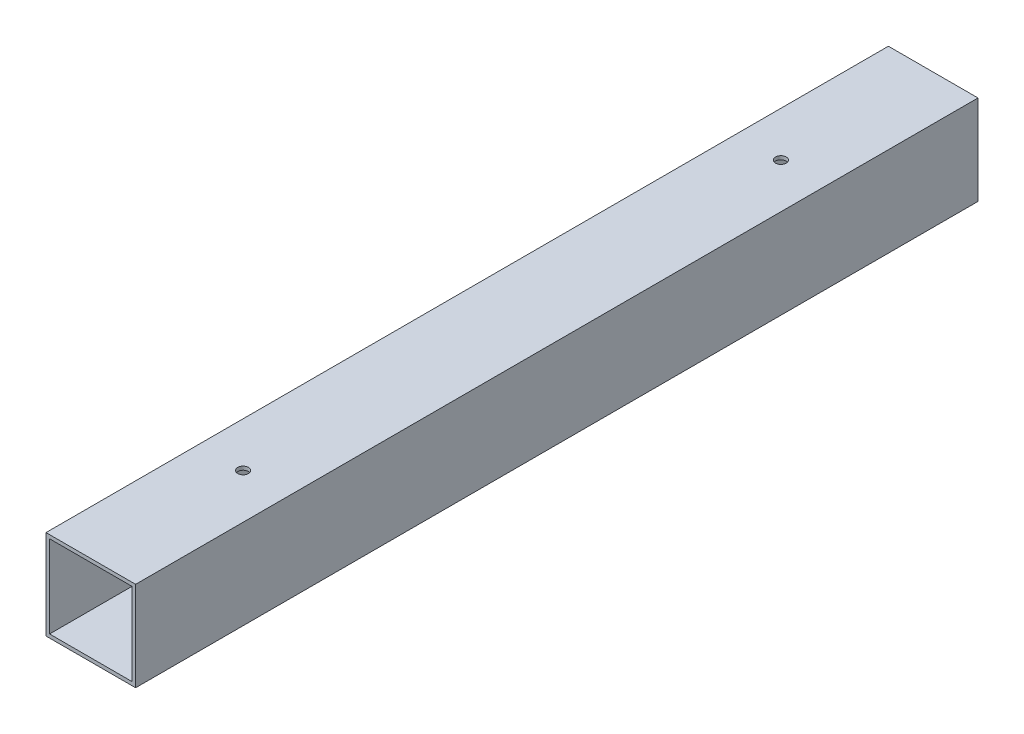
ISO-10303-21;
HEADER;
FILE_DESCRIPTION(('STEP AP214'),'2;1');
FILE_NAME('part.step','',(''),(''),'','','');
FILE_SCHEMA(('AUTOMOTIVE_DESIGN { 1 0 10303 214 1 1 1 1 }'));
ENDSEC;
DATA;
#1=APPLICATION_CONTEXT('core data for automotive mechanical design processes');
#2=APPLICATION_PROTOCOL_DEFINITION('international standard','automotive_design',2000,#1);
#3=PRODUCT_CONTEXT('',#1,'mechanical');
#4=PRODUCT('Part','Part','',(#3));
#5=PRODUCT_RELATED_PRODUCT_CATEGORY('part','',(#4));
#6=PRODUCT_DEFINITION_FORMATION('','',#4);
#7=PRODUCT_DEFINITION_CONTEXT('part definition',#1,'design');
#8=PRODUCT_DEFINITION('design','',#6,#7);
#9=PRODUCT_DEFINITION_SHAPE('','',#8);
#10=(LENGTH_UNIT() NAMED_UNIT(*) SI_UNIT(.MILLI.,.METRE.));
#11=(NAMED_UNIT(*) PLANE_ANGLE_UNIT() SI_UNIT($,.RADIAN.));
#12=(NAMED_UNIT(*) SI_UNIT($,.STERADIAN.) SOLID_ANGLE_UNIT());
#13=UNCERTAINTY_MEASURE_WITH_UNIT(LENGTH_MEASURE(1.E-05),#10,'distance_accuracy_value','');
#14=(GEOMETRIC_REPRESENTATION_CONTEXT(3) GLOBAL_UNCERTAINTY_ASSIGNED_CONTEXT((#13)) GLOBAL_UNIT_ASSIGNED_CONTEXT((#10,
#11,#12)) REPRESENTATION_CONTEXT('',''));
#15=CARTESIAN_POINT('',(0.,0.,0.));
#16=DIRECTION('',(0.,0.,1.));
#17=DIRECTION('',(1.,0.,0.));
#18=AXIS2_PLACEMENT_3D('',#15,#16,#17);
#19=CARTESIAN_POINT('',(0.,0.,117.5));
#20=DIRECTION('',(0.,0.,-1.));
#21=DIRECTION('',(-1.,0.,0.));
#22=AXIS2_PLACEMENT_3D('',#19,#20,#21);
#23=PLANE('',#22);
#24=DIRECTION('',(0.,1.,0.));
#25=VECTOR('',#24,1.);
#26=CARTESIAN_POINT('',(12.5,-12.5,117.5));
#27=LINE('',#26,#25);
#28=CARTESIAN_POINT('',(12.5,-12.5,117.5));
#29=VERTEX_POINT('',#28);
#30=CARTESIAN_POINT('',(12.5,12.5,117.5));
#31=VERTEX_POINT('',#30);
#32=EDGE_CURVE('E142',#29,#31,#27,.T.);
#33=ORIENTED_EDGE('',*,*,#32,.T.);
#34=DIRECTION('',(-1.,0.,0.));
#35=VECTOR('',#34,1.);
#36=CARTESIAN_POINT('',(-12.5,12.5,117.5));
#37=LINE('',#36,#35);
#38=CARTESIAN_POINT('',(-12.5,12.5,117.5));
#39=VERTEX_POINT('',#38);
#40=EDGE_CURVE('E145',#31,#39,#37,.T.);
#41=ORIENTED_EDGE('',*,*,#40,.T.);
#42=DIRECTION('',(0.,-1.,0.));
#43=VECTOR('',#42,1.);
#44=CARTESIAN_POINT('',(-12.5,-12.5,117.5));
#45=LINE('',#44,#43);
#46=CARTESIAN_POINT('',(-12.5,-12.5,117.5));
#47=VERTEX_POINT('',#46);
#48=EDGE_CURVE('E148',#39,#47,#45,.T.);
#49=ORIENTED_EDGE('',*,*,#48,.T.);
#50=DIRECTION('',(1.,0.,0.));
#51=VECTOR('',#50,1.);
#52=CARTESIAN_POINT('',(-12.5,-12.5,117.5));
#53=LINE('',#52,#51);
#54=EDGE_CURVE('E150',#47,#29,#53,.T.);
#55=ORIENTED_EDGE('',*,*,#54,.T.);
#56=EDGE_LOOP('',(#33,#41,#49,#55));
#57=FACE_BOUND('',#56,.T.);
#58=DIRECTION('',(0.,-1.,0.));
#59=VECTOR('',#58,1.);
#60=CARTESIAN_POINT('',(-11.5,-11.5,117.5));
#61=LINE('',#60,#59);
#62=CARTESIAN_POINT('',(-11.5,11.5,117.5));
#63=VERTEX_POINT('',#62);
#64=CARTESIAN_POINT('',(-11.5,-11.5,117.5));
#65=VERTEX_POINT('',#64);
#66=EDGE_CURVE('E104',#63,#65,#61,.T.);
#67=ORIENTED_EDGE('',*,*,#66,.F.);
#68=DIRECTION('',(-1.,0.,0.));
#69=VECTOR('',#68,1.);
#70=CARTESIAN_POINT('',(-11.5,11.5,117.5));
#71=LINE('',#70,#69);
#72=CARTESIAN_POINT('',(11.5,11.5,117.5));
#73=VERTEX_POINT('',#72);
#74=EDGE_CURVE('E126',#73,#63,#71,.T.);
#75=ORIENTED_EDGE('',*,*,#74,.F.);
#76=DIRECTION('',(0.,1.,0.));
#77=VECTOR('',#76,1.);
#78=CARTESIAN_POINT('',(11.5,-11.5,117.5));
#79=LINE('',#78,#77);
#80=CARTESIAN_POINT('',(11.5,-11.5,117.5));
#81=VERTEX_POINT('',#80);
#82=EDGE_CURVE('E124',#81,#73,#79,.T.);
#83=ORIENTED_EDGE('',*,*,#82,.F.);
#84=DIRECTION('',(1.,0.,0.));
#85=VECTOR('',#84,1.);
#86=CARTESIAN_POINT('',(-11.5,-11.5,117.5));
#87=LINE('',#86,#85);
#88=EDGE_CURVE('E112',#65,#81,#87,.T.);
#89=ORIENTED_EDGE('',*,*,#88,.F.);
#90=EDGE_LOOP('',(#67,#75,#83,#89));
#91=FACE_BOUND('',#90,.T.);
#92=ADVANCED_FACE('F37',(#57,#91),#23,.F.);
#93=CARTESIAN_POINT('',(0.,0.,-117.5));
#94=DIRECTION('',(0.,0.,-1.));
#95=DIRECTION('',(-1.,0.,0.));
#96=AXIS2_PLACEMENT_3D('',#93,#94,#95);
#97=PLANE('',#96);
#98=DIRECTION('',(0.,1.,0.));
#99=VECTOR('',#98,1.);
#100=CARTESIAN_POINT('',(12.5,-12.5,-117.5));
#101=LINE('',#100,#99);
#102=CARTESIAN_POINT('',(12.5,-12.5,-117.5));
#103=VERTEX_POINT('',#102);
#104=CARTESIAN_POINT('',(12.5,12.5,-117.5));
#105=VERTEX_POINT('',#104);
#106=EDGE_CURVE('E120',#103,#105,#101,.T.);
#107=ORIENTED_EDGE('',*,*,#106,.F.);
#108=DIRECTION('',(1.,0.,0.));
#109=VECTOR('',#108,1.);
#110=CARTESIAN_POINT('',(-12.5,-12.5,-117.5));
#111=LINE('',#110,#109);
#112=CARTESIAN_POINT('',(-12.5,-12.5,-117.5));
#113=VERTEX_POINT('',#112);
#114=EDGE_CURVE('E146',#113,#103,#111,.T.);
#115=ORIENTED_EDGE('',*,*,#114,.F.);
#116=DIRECTION('',(0.,-1.,0.));
#117=VECTOR('',#116,1.);
#118=CARTESIAN_POINT('',(-12.5,-12.5,-117.5));
#119=LINE('',#118,#117);
#120=CARTESIAN_POINT('',(-12.5,12.5,-117.5));
#121=VERTEX_POINT('',#120);
#122=EDGE_CURVE('E157',#121,#113,#119,.T.);
#123=ORIENTED_EDGE('',*,*,#122,.F.);
#124=DIRECTION('',(-1.,0.,0.));
#125=VECTOR('',#124,1.);
#126=CARTESIAN_POINT('',(-12.5,12.5,-117.5));
#127=LINE('',#126,#125);
#128=EDGE_CURVE('E155',#105,#121,#127,.T.);
#129=ORIENTED_EDGE('',*,*,#128,.F.);
#130=EDGE_LOOP('',(#107,#115,#123,#129));
#131=FACE_BOUND('',#130,.T.);
#132=DIRECTION('',(-1.,0.,0.));
#133=VECTOR('',#132,1.);
#134=CARTESIAN_POINT('',(-11.5,11.5,-117.5));
#135=LINE('',#134,#133);
#136=CARTESIAN_POINT('',(11.5,11.5,-117.5));
#137=VERTEX_POINT('',#136);
#138=CARTESIAN_POINT('',(-11.5,11.5,-117.5));
#139=VERTEX_POINT('',#138);
#140=EDGE_CURVE('E113',#137,#139,#135,.T.);
#141=ORIENTED_EDGE('',*,*,#140,.T.);
#142=DIRECTION('',(0.,-1.,0.));
#143=VECTOR('',#142,1.);
#144=CARTESIAN_POINT('',(-11.5,-11.5,-117.5));
#145=LINE('',#144,#143);
#146=CARTESIAN_POINT('',(-11.5,-11.5,-117.5));
#147=VERTEX_POINT('',#146);
#148=EDGE_CURVE('E62',#139,#147,#145,.T.);
#149=ORIENTED_EDGE('',*,*,#148,.T.);
#150=DIRECTION('',(1.,0.,0.));
#151=VECTOR('',#150,1.);
#152=CARTESIAN_POINT('',(-11.5,-11.5,-117.5));
#153=LINE('',#152,#151);
#154=CARTESIAN_POINT('',(11.5,-11.5,-117.5));
#155=VERTEX_POINT('',#154);
#156=EDGE_CURVE('E119',#147,#155,#153,.T.);
#157=ORIENTED_EDGE('',*,*,#156,.T.);
#158=DIRECTION('',(0.,1.,0.));
#159=VECTOR('',#158,1.);
#160=CARTESIAN_POINT('',(11.5,-11.5,-117.5));
#161=LINE('',#160,#159);
#162=EDGE_CURVE('E134',#155,#137,#161,.T.);
#163=ORIENTED_EDGE('',*,*,#162,.T.);
#164=EDGE_LOOP('',(#141,#149,#157,#163));
#165=FACE_BOUND('',#164,.T.);
#166=ADVANCED_FACE('F211',(#131,#165),#97,.T.);
#167=CARTESIAN_POINT('',(12.5,-12.5,117.5));
#168=DIRECTION('',(-1.,0.,0.));
#169=DIRECTION('',(0.,0.,1.));
#170=AXIS2_PLACEMENT_3D('',#167,#168,#169);
#171=PLANE('',#170);
#172=ORIENTED_EDGE('',*,*,#106,.T.);
#173=DIRECTION('',(0.,0.,-1.));
#174=VECTOR('',#173,1.);
#175=CARTESIAN_POINT('',(12.5,12.5,117.5));
#176=LINE('',#175,#174);
#177=EDGE_CURVE('E11',#31,#105,#176,.T.);
#178=ORIENTED_EDGE('',*,*,#177,.F.);
#179=ORIENTED_EDGE('',*,*,#32,.F.);
#180=DIRECTION('',(0.,0.,-1.));
#181=VECTOR('',#180,1.);
#182=CARTESIAN_POINT('',(12.5,-12.5,117.5));
#183=LINE('',#182,#181);
#184=EDGE_CURVE('E152',#29,#103,#183,.T.);
#185=ORIENTED_EDGE('',*,*,#184,.T.);
#186=EDGE_LOOP('',(#172,#178,#179,#185));
#187=FACE_BOUND('',#186,.T.);
#188=ADVANCED_FACE('F39',(#187),#171,.F.);
#189=CARTESIAN_POINT('',(-12.5,12.5,117.5));
#190=DIRECTION('',(0.,-1.,0.));
#191=DIRECTION('',(0.,0.,-1.));
#192=AXIS2_PLACEMENT_3D('',#189,#190,#191);
#193=PLANE('',#192);
#194=CARTESIAN_POINT('',(0.,12.5,-75.));
#195=DIRECTION('',(0.,-1.,0.));
#196=DIRECTION('',(0.,0.,-1.));
#197=AXIS2_PLACEMENT_3D('',#194,#195,#196);
#198=CIRCLE('',#197,1.5);
#199=CARTESIAN_POINT('',(0.,12.5,-73.5));
#200=VERTEX_POINT('',#199);
#201=EDGE_CURVE('E132',#200,#200,#198,.T.);
#202=ORIENTED_EDGE('',*,*,#201,.T.);
#203=EDGE_LOOP('',(#202));
#204=FACE_BOUND('',#203,.T.);
#205=CARTESIAN_POINT('',(0.,12.5,75.));
#206=DIRECTION('',(0.,-1.,0.));
#207=DIRECTION('',(0.,0.,-1.));
#208=AXIS2_PLACEMENT_3D('',#205,#206,#207);
#209=CIRCLE('',#208,1.5);
#210=CARTESIAN_POINT('',(0.,12.5,76.5));
#211=VERTEX_POINT('',#210);
#212=EDGE_CURVE('E173',#211,#211,#209,.T.);
#213=ORIENTED_EDGE('',*,*,#212,.T.);
#214=EDGE_LOOP('',(#213));
#215=FACE_BOUND('',#214,.T.);
#216=ORIENTED_EDGE('',*,*,#128,.T.);
#217=DIRECTION('',(0.,0.,-1.));
#218=VECTOR('',#217,1.);
#219=CARTESIAN_POINT('',(-12.5,12.5,117.5));
#220=LINE('',#219,#218);
#221=EDGE_CURVE('E46',#39,#121,#220,.T.);
#222=ORIENTED_EDGE('',*,*,#221,.F.);
#223=ORIENTED_EDGE('',*,*,#40,.F.);
#224=ORIENTED_EDGE('',*,*,#177,.T.);
#225=EDGE_LOOP('',(#216,#222,#223,#224));
#226=FACE_BOUND('',#225,.T.);
#227=ADVANCED_FACE('F190',(#204,#215,#226),#193,.F.);
#228=CARTESIAN_POINT('',(-12.5,-12.5,117.5));
#229=DIRECTION('',(1.,0.,0.));
#230=DIRECTION('',(0.,0.,-1.));
#231=AXIS2_PLACEMENT_3D('',#228,#229,#230);
#232=PLANE('',#231);
#233=ORIENTED_EDGE('',*,*,#122,.T.);
#234=DIRECTION('',(0.,0.,-1.));
#235=VECTOR('',#234,1.);
#236=CARTESIAN_POINT('',(-12.5,-12.5,117.5));
#237=LINE('',#236,#235);
#238=EDGE_CURVE('E162',#47,#113,#237,.T.);
#239=ORIENTED_EDGE('',*,*,#238,.F.);
#240=ORIENTED_EDGE('',*,*,#48,.F.);
#241=ORIENTED_EDGE('',*,*,#221,.T.);
#242=EDGE_LOOP('',(#233,#239,#240,#241));
#243=FACE_BOUND('',#242,.T.);
#244=ADVANCED_FACE('F225',(#243),#232,.F.);
#245=CARTESIAN_POINT('',(-12.5,-12.5,117.5));
#246=DIRECTION('',(0.,1.,0.));
#247=DIRECTION('',(0.,0.,1.));
#248=AXIS2_PLACEMENT_3D('',#245,#246,#247);
#249=PLANE('',#248);
#250=CARTESIAN_POINT('',(0.,-12.5,-75.));
#251=DIRECTION('',(0.,1.,0.));
#252=DIRECTION('',(0.,0.,1.));
#253=AXIS2_PLACEMENT_3D('',#250,#251,#252);
#254=CIRCLE('',#253,1.5);
#255=CARTESIAN_POINT('',(0.,-12.5,-73.5));
#256=VERTEX_POINT('',#255);
#257=EDGE_CURVE('E169',#256,#256,#254,.T.);
#258=ORIENTED_EDGE('',*,*,#257,.T.);
#259=EDGE_LOOP('',(#258));
#260=FACE_BOUND('',#259,.T.);
#261=CARTESIAN_POINT('',(0.,-12.5,75.));
#262=DIRECTION('',(0.,1.,0.));
#263=DIRECTION('',(0.,0.,1.));
#264=AXIS2_PLACEMENT_3D('',#261,#262,#263);
#265=CIRCLE('',#264,1.5);
#266=CARTESIAN_POINT('',(0.,-12.5,76.5));
#267=VERTEX_POINT('',#266);
#268=EDGE_CURVE('E176',#267,#267,#265,.T.);
#269=ORIENTED_EDGE('',*,*,#268,.T.);
#270=EDGE_LOOP('',(#269));
#271=FACE_BOUND('',#270,.T.);
#272=ORIENTED_EDGE('',*,*,#114,.T.);
#273=ORIENTED_EDGE('',*,*,#184,.F.);
#274=ORIENTED_EDGE('',*,*,#54,.F.);
#275=ORIENTED_EDGE('',*,*,#238,.T.);
#276=EDGE_LOOP('',(#272,#273,#274,#275));
#277=FACE_BOUND('',#276,.T.);
#278=ADVANCED_FACE('F222',(#260,#271,#277),#249,.F.);
#279=CARTESIAN_POINT('',(-11.5,-11.5,117.5));
#280=DIRECTION('',(1.,0.,0.));
#281=DIRECTION('',(0.,0.,-1.));
#282=AXIS2_PLACEMENT_3D('',#279,#280,#281);
#283=PLANE('',#282);
#284=ORIENTED_EDGE('',*,*,#148,.F.);
#285=DIRECTION('',(0.,0.,-1.));
#286=VECTOR('',#285,1.);
#287=CARTESIAN_POINT('',(-11.5,11.5,117.5));
#288=LINE('',#287,#286);
#289=EDGE_CURVE('E108',#63,#139,#288,.T.);
#290=ORIENTED_EDGE('',*,*,#289,.F.);
#291=ORIENTED_EDGE('',*,*,#66,.T.);
#292=DIRECTION('',(0.,0.,-1.));
#293=VECTOR('',#292,1.);
#294=CARTESIAN_POINT('',(-11.5,-11.5,117.5));
#295=LINE('',#294,#293);
#296=EDGE_CURVE('E107',#65,#147,#295,.T.);
#297=ORIENTED_EDGE('',*,*,#296,.T.);
#298=EDGE_LOOP('',(#284,#290,#291,#297));
#299=FACE_BOUND('',#298,.T.);
#300=ADVANCED_FACE('F106',(#299),#283,.T.);
#301=CARTESIAN_POINT('',(-11.5,-11.5,117.5));
#302=DIRECTION('',(0.,1.,0.));
#303=DIRECTION('',(0.,0.,1.));
#304=AXIS2_PLACEMENT_3D('',#301,#302,#303);
#305=PLANE('',#304);
#306=CARTESIAN_POINT('',(0.,-11.5,-75.));
#307=DIRECTION('',(0.,1.,0.));
#308=DIRECTION('',(0.,0.,1.));
#309=AXIS2_PLACEMENT_3D('',#306,#307,#308);
#310=CIRCLE('',#309,1.5);
#311=CARTESIAN_POINT('',(0.,-11.5,-73.5));
#312=VERTEX_POINT('',#311);
#313=EDGE_CURVE('E185',#312,#312,#310,.T.);
#314=ORIENTED_EDGE('',*,*,#313,.F.);
#315=EDGE_LOOP('',(#314));
#316=FACE_BOUND('',#315,.T.);
#317=CARTESIAN_POINT('',(0.,-11.5,75.));
#318=DIRECTION('',(0.,1.,0.));
#319=DIRECTION('',(0.,0.,1.));
#320=AXIS2_PLACEMENT_3D('',#317,#318,#319);
#321=CIRCLE('',#320,1.5);
#322=CARTESIAN_POINT('',(0.,-11.5,76.5));
#323=VERTEX_POINT('',#322);
#324=EDGE_CURVE('E168',#323,#323,#321,.T.);
#325=ORIENTED_EDGE('',*,*,#324,.F.);
#326=EDGE_LOOP('',(#325));
#327=FACE_BOUND('',#326,.T.);
#328=ORIENTED_EDGE('',*,*,#156,.F.);
#329=ORIENTED_EDGE('',*,*,#296,.F.);
#330=ORIENTED_EDGE('',*,*,#88,.T.);
#331=DIRECTION('',(0.,0.,-1.));
#332=VECTOR('',#331,1.);
#333=CARTESIAN_POINT('',(11.5,-11.5,117.5));
#334=LINE('',#333,#332);
#335=EDGE_CURVE('E121',#81,#155,#334,.T.);
#336=ORIENTED_EDGE('',*,*,#335,.T.);
#337=EDGE_LOOP('',(#328,#329,#330,#336));
#338=FACE_BOUND('',#337,.T.);
#339=ADVANCED_FACE('F116',(#316,#327,#338),#305,.T.);
#340=CARTESIAN_POINT('',(11.5,-11.5,117.5));
#341=DIRECTION('',(-1.,0.,0.));
#342=DIRECTION('',(0.,-1.,0.));
#343=AXIS2_PLACEMENT_3D('',#340,#341,#342);
#344=PLANE('',#343);
#345=ORIENTED_EDGE('',*,*,#162,.F.);
#346=ORIENTED_EDGE('',*,*,#335,.F.);
#347=ORIENTED_EDGE('',*,*,#82,.T.);
#348=DIRECTION('',(0.,0.,-1.));
#349=VECTOR('',#348,1.);
#350=CARTESIAN_POINT('',(11.5,11.5,117.5));
#351=LINE('',#350,#349);
#352=EDGE_CURVE('E54',#73,#137,#351,.T.);
#353=ORIENTED_EDGE('',*,*,#352,.T.);
#354=EDGE_LOOP('',(#345,#346,#347,#353));
#355=FACE_BOUND('',#354,.T.);
#356=ADVANCED_FACE('F250',(#355),#344,.T.);
#357=CARTESIAN_POINT('',(-11.5,11.5,117.5));
#358=DIRECTION('',(0.,-1.,0.));
#359=DIRECTION('',(0.,0.,-1.));
#360=AXIS2_PLACEMENT_3D('',#357,#358,#359);
#361=PLANE('',#360);
#362=CARTESIAN_POINT('',(0.,11.5,-75.));
#363=DIRECTION('',(0.,-1.,0.));
#364=DIRECTION('',(0.,0.,-1.));
#365=AXIS2_PLACEMENT_3D('',#362,#363,#364);
#366=CIRCLE('',#365,1.5);
#367=CARTESIAN_POINT('',(0.,11.5,-73.5));
#368=VERTEX_POINT('',#367);
#369=EDGE_CURVE('E41',#368,#368,#366,.T.);
#370=ORIENTED_EDGE('',*,*,#369,.F.);
#371=EDGE_LOOP('',(#370));
#372=FACE_BOUND('',#371,.T.);
#373=CARTESIAN_POINT('',(0.,11.5,75.));
#374=DIRECTION('',(0.,-1.,0.));
#375=DIRECTION('',(0.,0.,-1.));
#376=AXIS2_PLACEMENT_3D('',#373,#374,#375);
#377=CIRCLE('',#376,1.5);
#378=CARTESIAN_POINT('',(0.,11.5,76.5));
#379=VERTEX_POINT('',#378);
#380=EDGE_CURVE('E166',#379,#379,#377,.T.);
#381=ORIENTED_EDGE('',*,*,#380,.F.);
#382=EDGE_LOOP('',(#381));
#383=FACE_BOUND('',#382,.T.);
#384=ORIENTED_EDGE('',*,*,#140,.F.);
#385=ORIENTED_EDGE('',*,*,#352,.F.);
#386=ORIENTED_EDGE('',*,*,#74,.T.);
#387=ORIENTED_EDGE('',*,*,#289,.T.);
#388=EDGE_LOOP('',(#384,#385,#386,#387));
#389=FACE_BOUND('',#388,.T.);
#390=ADVANCED_FACE('F206',(#372,#383,#389),#361,.T.);
#391=CARTESIAN_POINT('',(0.,-12.5,75.));
#392=DIRECTION('',(0.,1.,0.));
#393=DIRECTION('',(0.,0.,1.));
#394=AXIS2_PLACEMENT_3D('',#391,#392,#393);
#395=CYLINDRICAL_SURFACE('',#394,1.5);
#396=CARTESIAN_POINT('',(0.,11.5,76.5));
#397=CARTESIAN_POINT('',(0.,11.5104166666667,76.5));
#398=CARTESIAN_POINT('',(0.,11.5208333333333,76.5));
#399=CARTESIAN_POINT('',(0.,11.5416666666667,76.5));
#400=CARTESIAN_POINT('',(0.,11.5520833333333,76.5));
#401=CARTESIAN_POINT('',(0.,11.5729166666667,76.5));
#402=CARTESIAN_POINT('',(0.,11.5833333333333,76.5));
#403=CARTESIAN_POINT('',(0.,11.6041666666667,76.5));
#404=CARTESIAN_POINT('',(0.,11.6145833333333,76.5));
#405=CARTESIAN_POINT('',(0.,11.6354166666667,76.5));
#406=CARTESIAN_POINT('',(0.,11.6458333333333,76.5));
#407=CARTESIAN_POINT('',(0.,11.6666666666667,76.5));
#408=CARTESIAN_POINT('',(0.,11.6770833333333,76.5));
#409=CARTESIAN_POINT('',(0.,11.6979166666667,76.5));
#410=CARTESIAN_POINT('',(0.,11.7083333333333,76.5));
#411=CARTESIAN_POINT('',(0.,11.7291666666667,76.5));
#412=CARTESIAN_POINT('',(0.,11.7395833333333,76.5));
#413=CARTESIAN_POINT('',(0.,11.7604166666667,76.5));
#414=CARTESIAN_POINT('',(0.,11.7708333333333,76.5));
#415=CARTESIAN_POINT('',(0.,11.7916666666667,76.5));
#416=CARTESIAN_POINT('',(0.,11.8020833333333,76.5));
#417=CARTESIAN_POINT('',(0.,11.8229166666667,76.5));
#418=CARTESIAN_POINT('',(0.,11.8333333333333,76.5));
#419=CARTESIAN_POINT('',(0.,11.8541666666667,76.5));
#420=CARTESIAN_POINT('',(0.,11.8645833333333,76.5));
#421=CARTESIAN_POINT('',(0.,11.8854166666667,76.5));
#422=CARTESIAN_POINT('',(0.,11.8958333333333,76.5));
#423=CARTESIAN_POINT('',(0.,11.9166666666667,76.5));
#424=CARTESIAN_POINT('',(0.,11.9270833333333,76.5));
#425=CARTESIAN_POINT('',(0.,11.9479166666667,76.5));
#426=CARTESIAN_POINT('',(0.,11.9583333333333,76.5));
#427=CARTESIAN_POINT('',(0.,11.9791666666667,76.5));
#428=CARTESIAN_POINT('',(0.,11.9895833333333,76.5));
#429=CARTESIAN_POINT('',(0.,12.0104166666667,76.5));
#430=CARTESIAN_POINT('',(0.,12.0208333333333,76.5));
#431=CARTESIAN_POINT('',(0.,12.0416666666667,76.5));
#432=CARTESIAN_POINT('',(0.,12.0520833333333,76.5));
#433=CARTESIAN_POINT('',(0.,12.0729166666667,76.5));
#434=CARTESIAN_POINT('',(0.,12.0833333333333,76.5));
#435=CARTESIAN_POINT('',(0.,12.1041666666667,76.5));
#436=CARTESIAN_POINT('',(0.,12.1145833333333,76.5));
#437=CARTESIAN_POINT('',(0.,12.1354166666667,76.5));
#438=CARTESIAN_POINT('',(0.,12.1458333333333,76.5));
#439=CARTESIAN_POINT('',(0.,12.1666666666667,76.5));
#440=CARTESIAN_POINT('',(0.,12.1770833333333,76.5));
#441=CARTESIAN_POINT('',(0.,12.1979166666667,76.5));
#442=CARTESIAN_POINT('',(0.,12.2083333333333,76.5));
#443=CARTESIAN_POINT('',(0.,12.2291666666667,76.5));
#444=CARTESIAN_POINT('',(0.,12.2395833333333,76.5));
#445=CARTESIAN_POINT('',(0.,12.2604166666667,76.5));
#446=CARTESIAN_POINT('',(0.,12.2708333333333,76.5));
#447=CARTESIAN_POINT('',(0.,12.2916666666667,76.5));
#448=CARTESIAN_POINT('',(0.,12.3020833333333,76.5));
#449=CARTESIAN_POINT('',(0.,12.3229166666667,76.5));
#450=CARTESIAN_POINT('',(0.,12.3333333333333,76.5));
#451=CARTESIAN_POINT('',(0.,12.3541666666667,76.5));
#452=CARTESIAN_POINT('',(0.,12.3645833333333,76.5));
#453=CARTESIAN_POINT('',(0.,12.3854166666667,76.5));
#454=CARTESIAN_POINT('',(0.,12.3958333333333,76.5));
#455=CARTESIAN_POINT('',(0.,12.4166666666667,76.5));
#456=CARTESIAN_POINT('',(0.,12.4270833333333,76.5));
#457=CARTESIAN_POINT('',(0.,12.4479166666667,76.5));
#458=CARTESIAN_POINT('',(0.,12.4583333333333,76.5));
#459=CARTESIAN_POINT('',(0.,12.4791666666667,76.5));
#460=CARTESIAN_POINT('',(0.,12.4895833333333,76.5));
#461=CARTESIAN_POINT('',(0.,12.5,76.5));
#462=B_SPLINE_CURVE_WITH_KNOTS('',3,(#396,#397,#398,#399,#400,#401,#402,#403,#404,#405,#406,
#407,#408,#409,#410,#411,#412,#413,#414,#415,#416,#417,#418,#419,#420,#421,#422,#423,#424,#425,
#426,#427,#428,#429,#430,#431,#432,#433,#434,#435,#436,#437,#438,#439,#440,#441,#442,#443,#444,
#445,#446,#447,#448,#449,#450,#451,#452,#453,#454,#455,#456,#457,#458,#459,#460,#461),
.UNSPECIFIED.,.F.,.F.,(4,2,2,2,2,2,2,2,2,2,2,2,2,2,2,2,2,2,2,2,2,2,2,2,2,2,2,2,2,2,2,2,4),(0.,
0.03125,0.0625000000000001,0.0937500000000001,0.125,0.15625,0.1875,0.21875,0.25,0.28125,0.3125,
0.34375,0.375,0.40625,0.4375,0.46875,0.5,0.53125,0.5625,0.593750000000001,0.625000000000001,
0.656250000000001,0.687500000000001,0.718750000000001,0.750000000000001,0.781250000000001,
0.812500000000001,0.843750000000001,0.875000000000001,0.906250000000001,0.937500000000001,
0.968750000000001,1.),.UNSPECIFIED.);
#463=EDGE_CURVE('BSEAM196',#379,#211,#462,.T.);
#464=ORIENTED_EDGE('',*,*,#380,.T.);
#465=ORIENTED_EDGE('',*,*,#212,.F.);
#466=ORIENTED_EDGE('',*,*,#463,.T.);
#467=ORIENTED_EDGE('',*,*,#463,.F.);
#468=EDGE_LOOP('',(#464,#466,#465,#467));
#469=FACE_BOUND('',#468,.T.);
#470=ADVANCED_FACE('F196',(#469),#395,.F.);
#471=CARTESIAN_POINT('',(0.,-12.5,-75.));
#472=DIRECTION('',(0.,1.,0.));
#473=DIRECTION('',(0.,0.,1.));
#474=AXIS2_PLACEMENT_3D('',#471,#472,#473);
#475=CYLINDRICAL_SURFACE('',#474,1.5);
#476=CARTESIAN_POINT('',(0.,11.5,-73.5));
#477=CARTESIAN_POINT('',(0.,11.5104166666667,-73.5));
#478=CARTESIAN_POINT('',(0.,11.5208333333333,-73.5));
#479=CARTESIAN_POINT('',(0.,11.5416666666667,-73.5));
#480=CARTESIAN_POINT('',(0.,11.5520833333333,-73.5));
#481=CARTESIAN_POINT('',(0.,11.5729166666667,-73.5));
#482=CARTESIAN_POINT('',(0.,11.5833333333333,-73.5));
#483=CARTESIAN_POINT('',(0.,11.6041666666667,-73.5));
#484=CARTESIAN_POINT('',(0.,11.6145833333333,-73.5));
#485=CARTESIAN_POINT('',(0.,11.6354166666667,-73.5));
#486=CARTESIAN_POINT('',(0.,11.6458333333333,-73.5));
#487=CARTESIAN_POINT('',(0.,11.6666666666667,-73.5));
#488=CARTESIAN_POINT('',(0.,11.6770833333333,-73.5));
#489=CARTESIAN_POINT('',(0.,11.6979166666667,-73.5));
#490=CARTESIAN_POINT('',(0.,11.7083333333333,-73.5));
#491=CARTESIAN_POINT('',(0.,11.7291666666667,-73.5));
#492=CARTESIAN_POINT('',(0.,11.7395833333333,-73.5));
#493=CARTESIAN_POINT('',(0.,11.7604166666667,-73.5));
#494=CARTESIAN_POINT('',(0.,11.7708333333333,-73.5));
#495=CARTESIAN_POINT('',(0.,11.7916666666667,-73.5));
#496=CARTESIAN_POINT('',(0.,11.8020833333333,-73.5));
#497=CARTESIAN_POINT('',(0.,11.8229166666667,-73.5));
#498=CARTESIAN_POINT('',(0.,11.8333333333333,-73.5));
#499=CARTESIAN_POINT('',(0.,11.8541666666667,-73.5));
#500=CARTESIAN_POINT('',(0.,11.8645833333333,-73.5));
#501=CARTESIAN_POINT('',(0.,11.8854166666667,-73.5));
#502=CARTESIAN_POINT('',(0.,11.8958333333333,-73.5));
#503=CARTESIAN_POINT('',(0.,11.9166666666667,-73.5));
#504=CARTESIAN_POINT('',(0.,11.9270833333333,-73.5));
#505=CARTESIAN_POINT('',(0.,11.9479166666667,-73.5));
#506=CARTESIAN_POINT('',(0.,11.9583333333333,-73.5));
#507=CARTESIAN_POINT('',(0.,11.9791666666667,-73.5));
#508=CARTESIAN_POINT('',(0.,11.9895833333333,-73.5));
#509=CARTESIAN_POINT('',(0.,12.0104166666667,-73.5));
#510=CARTESIAN_POINT('',(0.,12.0208333333333,-73.5));
#511=CARTESIAN_POINT('',(0.,12.0416666666667,-73.5));
#512=CARTESIAN_POINT('',(0.,12.0520833333333,-73.5));
#513=CARTESIAN_POINT('',(0.,12.0729166666667,-73.5));
#514=CARTESIAN_POINT('',(0.,12.0833333333333,-73.5));
#515=CARTESIAN_POINT('',(0.,12.1041666666667,-73.5));
#516=CARTESIAN_POINT('',(0.,12.1145833333333,-73.5));
#517=CARTESIAN_POINT('',(0.,12.1354166666667,-73.5));
#518=CARTESIAN_POINT('',(0.,12.1458333333333,-73.5));
#519=CARTESIAN_POINT('',(0.,12.1666666666667,-73.5));
#520=CARTESIAN_POINT('',(0.,12.1770833333333,-73.5));
#521=CARTESIAN_POINT('',(0.,12.1979166666667,-73.5));
#522=CARTESIAN_POINT('',(0.,12.2083333333333,-73.5));
#523=CARTESIAN_POINT('',(0.,12.2291666666667,-73.5));
#524=CARTESIAN_POINT('',(0.,12.2395833333333,-73.5));
#525=CARTESIAN_POINT('',(0.,12.2604166666667,-73.5));
#526=CARTESIAN_POINT('',(0.,12.2708333333333,-73.5));
#527=CARTESIAN_POINT('',(0.,12.2916666666667,-73.5));
#528=CARTESIAN_POINT('',(0.,12.3020833333333,-73.5));
#529=CARTESIAN_POINT('',(0.,12.3229166666667,-73.5));
#530=CARTESIAN_POINT('',(0.,12.3333333333333,-73.5));
#531=CARTESIAN_POINT('',(0.,12.3541666666667,-73.5));
#532=CARTESIAN_POINT('',(0.,12.3645833333333,-73.5));
#533=CARTESIAN_POINT('',(0.,12.3854166666667,-73.5));
#534=CARTESIAN_POINT('',(0.,12.3958333333333,-73.5));
#535=CARTESIAN_POINT('',(0.,12.4166666666667,-73.5));
#536=CARTESIAN_POINT('',(0.,12.4270833333333,-73.5));
#537=CARTESIAN_POINT('',(0.,12.4479166666667,-73.5));
#538=CARTESIAN_POINT('',(0.,12.4583333333333,-73.5));
#539=CARTESIAN_POINT('',(0.,12.4791666666667,-73.5));
#540=CARTESIAN_POINT('',(0.,12.4895833333333,-73.5));
#541=CARTESIAN_POINT('',(0.,12.5,-73.5));
#542=B_SPLINE_CURVE_WITH_KNOTS('',3,(#476,#477,#478,#479,#480,#481,#482,#483,#484,#485,#486,
#487,#488,#489,#490,#491,#492,#493,#494,#495,#496,#497,#498,#499,#500,#501,#502,#503,#504,#505,
#506,#507,#508,#509,#510,#511,#512,#513,#514,#515,#516,#517,#518,#519,#520,#521,#522,#523,#524,
#525,#526,#527,#528,#529,#530,#531,#532,#533,#534,#535,#536,#537,#538,#539,#540,#541),
.UNSPECIFIED.,.F.,.F.,(4,2,2,2,2,2,2,2,2,2,2,2,2,2,2,2,2,2,2,2,2,2,2,2,2,2,2,2,2,2,2,2,4),(0.,
0.03125,0.0625000000000001,0.0937500000000001,0.125,0.15625,0.1875,0.21875,0.25,0.28125,0.3125,
0.34375,0.375,0.40625,0.4375,0.46875,0.5,0.53125,0.5625,0.593750000000001,0.625000000000001,
0.656250000000001,0.687500000000001,0.718750000000001,0.750000000000001,0.781250000000001,
0.812500000000001,0.843750000000001,0.875000000000001,0.906250000000001,0.937500000000001,
0.968750000000001,1.),.UNSPECIFIED.);
#543=EDGE_CURVE('BSEAM193',#368,#200,#542,.T.);
#544=ORIENTED_EDGE('',*,*,#369,.T.);
#545=ORIENTED_EDGE('',*,*,#201,.F.);
#546=ORIENTED_EDGE('',*,*,#543,.T.);
#547=ORIENTED_EDGE('',*,*,#543,.F.);
#548=EDGE_LOOP('',(#544,#546,#545,#547));
#549=FACE_BOUND('',#548,.T.);
#550=ADVANCED_FACE('F193',(#549),#475,.F.);
#551=ORIENTED_EDGE('',*,*,#324,.T.);
#552=EDGE_LOOP('',(#551));
#553=FACE_BOUND('',#552,.T.);
#554=ORIENTED_EDGE('',*,*,#268,.F.);
#555=EDGE_LOOP('',(#554));
#556=FACE_BOUND('',#555,.T.);
#557=ADVANCED_FACE('F195',(#553,#556),#395,.F.);
#558=ORIENTED_EDGE('',*,*,#313,.T.);
#559=EDGE_LOOP('',(#558));
#560=FACE_BOUND('',#559,.T.);
#561=ORIENTED_EDGE('',*,*,#257,.F.);
#562=EDGE_LOOP('',(#561));
#563=FACE_BOUND('',#562,.T.);
#564=ADVANCED_FACE('F199',(#560,#563),#475,.F.);
#565=CLOSED_SHELL('',(#92,#166,#188,#227,#244,#278,#300,#339,#356,#390,#470,#550,#557,#564));
#566=MANIFOLD_SOLID_BREP('B2',#565);
#567=ADVANCED_BREP_SHAPE_REPRESENTATION('',(#18,#566),#14);
#568=SHAPE_DEFINITION_REPRESENTATION(#9,#567);
ENDSEC;
END-ISO-10303-21;
